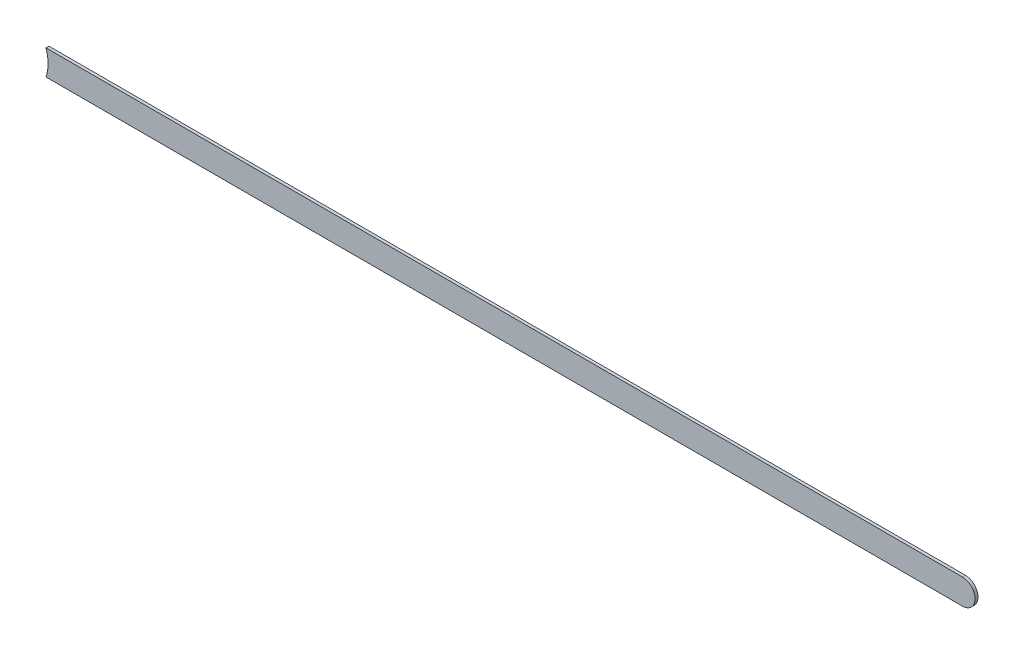
ISO-10303-21;
HEADER;
FILE_DESCRIPTION(('STEP AP214'),'2;1');
FILE_NAME('part.step','',(''),(''),'','','');
FILE_SCHEMA(('AUTOMOTIVE_DESIGN { 1 0 10303 214 1 1 1 1 }'));
ENDSEC;
DATA;
#1=APPLICATION_CONTEXT('core data for automotive mechanical design processes');
#2=APPLICATION_PROTOCOL_DEFINITION('international standard','automotive_design',2000,#1);
#3=PRODUCT_CONTEXT('',#1,'mechanical');
#4=PRODUCT('Part','Part','',(#3));
#5=PRODUCT_RELATED_PRODUCT_CATEGORY('part','',(#4));
#6=PRODUCT_DEFINITION_FORMATION('','',#4);
#7=PRODUCT_DEFINITION_CONTEXT('part definition',#1,'design');
#8=PRODUCT_DEFINITION('design','',#6,#7);
#9=PRODUCT_DEFINITION_SHAPE('','',#8);
#10=(LENGTH_UNIT() NAMED_UNIT(*) SI_UNIT(.MILLI.,.METRE.));
#11=(NAMED_UNIT(*) PLANE_ANGLE_UNIT() SI_UNIT($,.RADIAN.));
#12=(NAMED_UNIT(*) SI_UNIT($,.STERADIAN.) SOLID_ANGLE_UNIT());
#13=UNCERTAINTY_MEASURE_WITH_UNIT(LENGTH_MEASURE(1.E-05),#10,'distance_accuracy_value','');
#14=(GEOMETRIC_REPRESENTATION_CONTEXT(3) GLOBAL_UNCERTAINTY_ASSIGNED_CONTEXT((#13)) GLOBAL_UNIT_ASSIGNED_CONTEXT((#10,
#11,#12)) REPRESENTATION_CONTEXT('',''));
#15=CARTESIAN_POINT('',(0.,0.,0.));
#16=DIRECTION('',(0.,0.,1.));
#17=DIRECTION('',(1.,0.,0.));
#18=AXIS2_PLACEMENT_3D('',#15,#16,#17);
#19=CARTESIAN_POINT('',(81.265,-112.065,1.6));
#20=DIRECTION('',(0.,1.,0.));
#21=DIRECTION('',(1.,0.,0.));
#22=AXIS2_PLACEMENT_3D('',#19,#20,#21);
#23=PLANE('',#22);
#24=DIRECTION('',(0.,0.,1.));
#25=VECTOR('',#24,1.);
#26=CARTESIAN_POINT('',(92.59,-112.065,1.6));
#27=LINE('',#26,#25);
#28=CARTESIAN_POINT('',(92.59,-112.065,1.6));
#29=VERTEX_POINT('',#28);
#30=CARTESIAN_POINT('',(92.59,-112.065,1.635));
#31=VERTEX_POINT('',#30);
#32=EDGE_CURVE('E11',#29,#31,#27,.T.);
#33=ORIENTED_EDGE('',*,*,#32,.T.);
#34=DIRECTION('',(1.,0.,0.));
#35=VECTOR('',#34,1.);
#36=CARTESIAN_POINT('',(81.265,-112.065,1.635));
#37=LINE('',#36,#35);
#38=CARTESIAN_POINT('',(81.715693909425,-112.065,1.635));
#39=VERTEX_POINT('',#38);
#40=EDGE_CURVE('E25',#39,#31,#37,.T.);
#41=ORIENTED_EDGE('',*,*,#40,.F.);
#42=DIRECTION('',(0.,0.,-1.));
#43=VECTOR('',#42,1.);
#44=CARTESIAN_POINT('',(81.715693909433,-112.065,-0.045));
#45=LINE('',#44,#43);
#46=CARTESIAN_POINT('',(81.715693909425,-112.065,1.6));
#47=VERTEX_POINT('',#46);
#48=EDGE_CURVE('E73',#39,#47,#45,.T.);
#49=ORIENTED_EDGE('',*,*,#48,.T.);
#50=DIRECTION('',(1.,0.,0.));
#51=VECTOR('',#50,1.);
#52=CARTESIAN_POINT('',(81.265,-112.065,1.6));
#53=LINE('',#52,#51);
#54=EDGE_CURVE('E99',#47,#29,#53,.T.);
#55=ORIENTED_EDGE('',*,*,#54,.T.);
#56=EDGE_LOOP('',(#33,#41,#49,#55));
#57=FACE_BOUND('',#56,.T.);
#58=ADVANCED_FACE('F17',(#57),#23,.F.);
#59=CARTESIAN_POINT('',(92.59,-111.915,1.6));
#60=DIRECTION('',(0.,0.,-1.));
#61=DIRECTION('',(0.,-1.,0.));
#62=AXIS2_PLACEMENT_3D('',#59,#60,#61);
#63=CYLINDRICAL_SURFACE('',#62,0.15);
#64=CARTESIAN_POINT('',(92.59,-111.915,1.6));
#65=DIRECTION('',(0.,0.,1.));
#66=DIRECTION('',(0.,-1.,0.));
#67=AXIS2_PLACEMENT_3D('',#64,#65,#66);
#68=CIRCLE('',#67,0.15);
#69=CARTESIAN_POINT('',(92.59,-111.765,1.6));
#70=VERTEX_POINT('',#69);
#71=EDGE_CURVE('E76',#29,#70,#68,.T.);
#72=ORIENTED_EDGE('',*,*,#71,.T.);
#73=DIRECTION('',(0.,0.,1.));
#74=VECTOR('',#73,1.);
#75=CARTESIAN_POINT('',(92.59,-111.765,1.6));
#76=LINE('',#75,#74);
#77=CARTESIAN_POINT('',(92.59,-111.765,1.635));
#78=VERTEX_POINT('',#77);
#79=EDGE_CURVE('E87',#70,#78,#76,.T.);
#80=ORIENTED_EDGE('',*,*,#79,.T.);
#81=CARTESIAN_POINT('',(92.59,-111.915,1.635));
#82=DIRECTION('',(0.,0.,1.));
#83=DIRECTION('',(0.,-1.,0.));
#84=AXIS2_PLACEMENT_3D('',#81,#82,#83);
#85=CIRCLE('',#84,0.15);
#86=EDGE_CURVE('E82',#31,#78,#85,.T.);
#87=ORIENTED_EDGE('',*,*,#86,.F.);
#88=ORIENTED_EDGE('',*,*,#32,.F.);
#89=EDGE_LOOP('',(#72,#80,#87,#88));
#90=FACE_BOUND('',#89,.T.);
#91=ADVANCED_FACE('F186',(#90),#63,.T.);
#92=CARTESIAN_POINT('',(92.59,-111.765,1.635));
#93=DIRECTION('',(0.,0.,1.));
#94=DIRECTION('',(1.,0.,0.));
#95=AXIS2_PLACEMENT_3D('',#92,#93,#94);
#96=PLANE('',#95);
#97=ORIENTED_EDGE('',*,*,#86,.T.);
#98=DIRECTION('',(-1.,0.,0.));
#99=VECTOR('',#98,1.);
#100=CARTESIAN_POINT('',(92.59,-111.765,1.635));
#101=LINE('',#100,#99);
#102=CARTESIAN_POINT('',(81.715693909427,-111.765,1.635));
#103=VERTEX_POINT('',#102);
#104=EDGE_CURVE('E79',#78,#103,#101,.T.);
#105=ORIENTED_EDGE('',*,*,#104,.T.);
#106=CARTESIAN_POINT('',(81.265,-111.915,1.635));
#107=DIRECTION('',(0.,0.,-1.));
#108=DIRECTION('',(0.,-1.,0.));
#109=AXIS2_PLACEMENT_3D('',#106,#107,#108);
#110=CIRCLE('',#109,0.475);
#111=EDGE_CURVE('E67',#103,#39,#110,.T.);
#112=ORIENTED_EDGE('',*,*,#111,.T.);
#113=ORIENTED_EDGE('',*,*,#40,.T.);
#114=EDGE_LOOP('',(#97,#105,#112,#113));
#115=FACE_BOUND('',#114,.T.);
#116=ADVANCED_FACE('F80',(#115),#96,.T.);
#117=CARTESIAN_POINT('',(81.265,-111.915,-0.045));
#118=DIRECTION('',(0.,0.,-1.));
#119=DIRECTION('',(0.,-1.,0.));
#120=AXIS2_PLACEMENT_3D('',#117,#118,#119);
#121=CYLINDRICAL_SURFACE('',#120,0.475);
#122=ORIENTED_EDGE('',*,*,#111,.F.);
#123=DIRECTION('',(0.,0.,-1.));
#124=VECTOR('',#123,1.);
#125=CARTESIAN_POINT('',(81.715693909433,-111.765,-0.045));
#126=LINE('',#125,#124);
#127=CARTESIAN_POINT('',(81.715693909427,-111.765,1.6));
#128=VERTEX_POINT('',#127);
#129=EDGE_CURVE('E72',#103,#128,#126,.T.);
#130=ORIENTED_EDGE('',*,*,#129,.T.);
#131=CARTESIAN_POINT('',(81.265,-111.915,1.6));
#132=DIRECTION('',(0.,0.,-1.));
#133=DIRECTION('',(0.,-1.,0.));
#134=AXIS2_PLACEMENT_3D('',#131,#132,#133);
#135=CIRCLE('',#134,0.475);
#136=EDGE_CURVE('E101',#128,#47,#135,.T.);
#137=ORIENTED_EDGE('',*,*,#136,.T.);
#138=ORIENTED_EDGE('',*,*,#48,.F.);
#139=EDGE_LOOP('',(#122,#130,#137,#138));
#140=FACE_BOUND('',#139,.T.);
#141=ADVANCED_FACE('F69',(#140),#121,.F.);
#142=CARTESIAN_POINT('',(92.59,-111.765,1.6));
#143=DIRECTION('',(0.,0.,1.));
#144=DIRECTION('',(1.,0.,0.));
#145=AXIS2_PLACEMENT_3D('',#142,#143,#144);
#146=PLANE('',#145);
#147=ORIENTED_EDGE('',*,*,#54,.F.);
#148=ORIENTED_EDGE('',*,*,#136,.F.);
#149=DIRECTION('',(-1.,0.,0.));
#150=VECTOR('',#149,1.);
#151=CARTESIAN_POINT('',(92.59,-111.765,1.6));
#152=LINE('',#151,#150);
#153=EDGE_CURVE('E92',#70,#128,#152,.T.);
#154=ORIENTED_EDGE('',*,*,#153,.F.);
#155=ORIENTED_EDGE('',*,*,#71,.F.);
#156=EDGE_LOOP('',(#147,#148,#154,#155));
#157=FACE_BOUND('',#156,.T.);
#158=ADVANCED_FACE('F158',(#157),#146,.F.);
#159=CARTESIAN_POINT('',(92.59,-111.765,1.6));
#160=DIRECTION('',(0.,-1.,0.));
#161=DIRECTION('',(0.,0.,-1.));
#162=AXIS2_PLACEMENT_3D('',#159,#160,#161);
#163=PLANE('',#162);
#164=ORIENTED_EDGE('',*,*,#129,.F.);
#165=ORIENTED_EDGE('',*,*,#104,.F.);
#166=ORIENTED_EDGE('',*,*,#79,.F.);
#167=ORIENTED_EDGE('',*,*,#153,.T.);
#168=EDGE_LOOP('',(#164,#165,#166,#167));
#169=FACE_BOUND('',#168,.T.);
#170=ADVANCED_FACE('F90',(#169),#163,.F.);
#171=CLOSED_SHELL('',(#58,#91,#116,#141,#158,#170));
#172=MANIFOLD_SOLID_BREP('B1',#171);
#173=ADVANCED_BREP_SHAPE_REPRESENTATION('',(#18,#172),#14);
#174=SHAPE_DEFINITION_REPRESENTATION(#9,#173);
ENDSEC;
END-ISO-10303-21;
